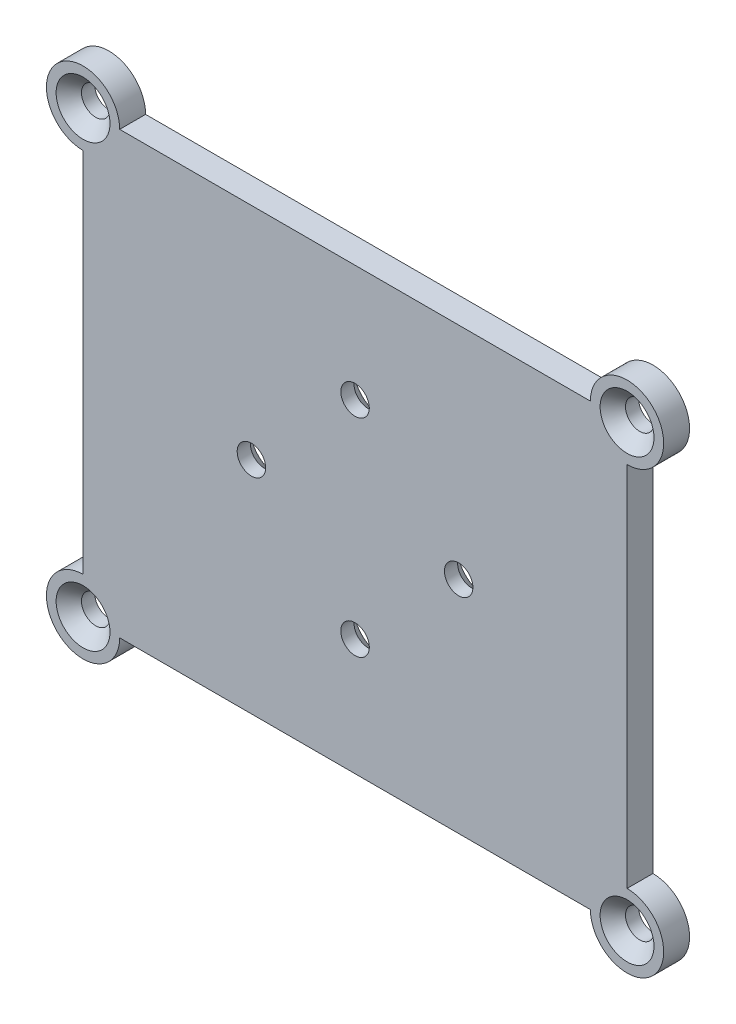
ISO-10303-21;
HEADER;
FILE_DESCRIPTION(('STEP AP214'),'2;1');
FILE_NAME('part.step','',(''),(''),'','','');
FILE_SCHEMA(('AUTOMOTIVE_DESIGN { 1 0 10303 214 1 1 1 1 }'));
ENDSEC;
DATA;
#1=APPLICATION_CONTEXT('core data for automotive mechanical design processes');
#2=APPLICATION_PROTOCOL_DEFINITION('international standard','automotive_design',2000,#1);
#3=PRODUCT_CONTEXT('',#1,'mechanical');
#4=PRODUCT('Part','Part','',(#3));
#5=PRODUCT_RELATED_PRODUCT_CATEGORY('part','',(#4));
#6=PRODUCT_DEFINITION_FORMATION('','',#4);
#7=PRODUCT_DEFINITION_CONTEXT('part definition',#1,'design');
#8=PRODUCT_DEFINITION('design','',#6,#7);
#9=PRODUCT_DEFINITION_SHAPE('','',#8);
#10=(LENGTH_UNIT() NAMED_UNIT(*) SI_UNIT(.MILLI.,.METRE.));
#11=(NAMED_UNIT(*) PLANE_ANGLE_UNIT() SI_UNIT($,.RADIAN.));
#12=(NAMED_UNIT(*) SI_UNIT($,.STERADIAN.) SOLID_ANGLE_UNIT());
#13=UNCERTAINTY_MEASURE_WITH_UNIT(LENGTH_MEASURE(1.E-05),#10,'distance_accuracy_value','');
#14=(GEOMETRIC_REPRESENTATION_CONTEXT(3) GLOBAL_UNCERTAINTY_ASSIGNED_CONTEXT((#13)) GLOBAL_UNIT_ASSIGNED_CONTEXT((#10,
#11,#12)) REPRESENTATION_CONTEXT('',''));
#15=CARTESIAN_POINT('',(0.,0.,0.));
#16=DIRECTION('',(0.,0.,1.));
#17=DIRECTION('',(1.,0.,0.));
#18=AXIS2_PLACEMENT_3D('',#15,#16,#17);
#19=CARTESIAN_POINT('',(0.,0.,5.));
#20=DIRECTION('',(0.,0.,-1.));
#21=DIRECTION('',(-1.,0.,0.));
#22=AXIS2_PLACEMENT_3D('',#19,#20,#21);
#23=PLANE('',#22);
#24=CARTESIAN_POINT('',(-52.5,42.5,5.));
#25=DIRECTION('',(0.,0.,1.));
#26=DIRECTION('',(1.,0.,0.));
#27=AXIS2_PLACEMENT_3D('',#24,#25,#26);
#28=CIRCLE('',#27,5.2);
#29=CARTESIAN_POINT('',(-47.3,42.5,5.));
#30=VERTEX_POINT('',#29);
#31=EDGE_CURVE('E333',#30,#30,#28,.T.);
#32=ORIENTED_EDGE('',*,*,#31,.F.);
#33=EDGE_LOOP('',(#32));
#34=FACE_BOUND('',#33,.T.);
#35=CARTESIAN_POINT('',(52.5,42.5,5.));
#36=DIRECTION('',(0.,0.,1.));
#37=DIRECTION('',(1.,0.,0.));
#38=AXIS2_PLACEMENT_3D('',#35,#36,#37);
#39=CIRCLE('',#38,5.2);
#40=CARTESIAN_POINT('',(57.7,42.5,5.));
#41=VERTEX_POINT('',#40);
#42=EDGE_CURVE('E338',#41,#41,#39,.T.);
#43=ORIENTED_EDGE('',*,*,#42,.F.);
#44=EDGE_LOOP('',(#43));
#45=FACE_BOUND('',#44,.T.);
#46=CARTESIAN_POINT('',(52.5,-42.5,5.));
#47=DIRECTION('',(0.,0.,1.));
#48=DIRECTION('',(1.,0.,0.));
#49=AXIS2_PLACEMENT_3D('',#46,#47,#48);
#50=CIRCLE('',#49,5.2);
#51=CARTESIAN_POINT('',(57.7,-42.5,5.));
#52=VERTEX_POINT('',#51);
#53=EDGE_CURVE('E345',#52,#52,#50,.T.);
#54=ORIENTED_EDGE('',*,*,#53,.F.);
#55=EDGE_LOOP('',(#54));
#56=FACE_BOUND('',#55,.T.);
#57=CARTESIAN_POINT('',(-52.5,-42.5,5.));
#58=DIRECTION('',(0.,0.,1.));
#59=DIRECTION('',(1.,0.,0.));
#60=AXIS2_PLACEMENT_3D('',#57,#58,#59);
#61=CIRCLE('',#60,5.2);
#62=CARTESIAN_POINT('',(-47.3,-42.5,5.));
#63=VERTEX_POINT('',#62);
#64=EDGE_CURVE('E352',#63,#63,#61,.T.);
#65=ORIENTED_EDGE('',*,*,#64,.F.);
#66=EDGE_LOOP('',(#65));
#67=FACE_BOUND('',#66,.T.);
#68=CARTESIAN_POINT('',(0.,20.,5.));
#69=DIRECTION('',(0.,0.,-1.));
#70=DIRECTION('',(-1.,0.,0.));
#71=AXIS2_PLACEMENT_3D('',#68,#69,#70);
#72=CIRCLE('',#71,2.75);
#73=CARTESIAN_POINT('',(-2.75,20.,5.));
#74=VERTEX_POINT('',#73);
#75=EDGE_CURVE('E177',#74,#74,#72,.T.);
#76=ORIENTED_EDGE('',*,*,#75,.T.);
#77=EDGE_LOOP('',(#76));
#78=FACE_BOUND('',#77,.T.);
#79=CARTESIAN_POINT('',(-20.,0.,5.));
#80=DIRECTION('',(0.,0.,-1.));
#81=DIRECTION('',(-1.,0.,0.));
#82=AXIS2_PLACEMENT_3D('',#79,#80,#81);
#83=CIRCLE('',#82,2.75);
#84=CARTESIAN_POINT('',(-22.75,0.,5.));
#85=VERTEX_POINT('',#84);
#86=EDGE_CURVE('E186',#85,#85,#83,.T.);
#87=ORIENTED_EDGE('',*,*,#86,.T.);
#88=EDGE_LOOP('',(#87));
#89=FACE_BOUND('',#88,.T.);
#90=CARTESIAN_POINT('',(0.,-20.,5.));
#91=DIRECTION('',(0.,0.,-1.));
#92=DIRECTION('',(-1.,0.,0.));
#93=AXIS2_PLACEMENT_3D('',#90,#91,#92);
#94=CIRCLE('',#93,2.75);
#95=CARTESIAN_POINT('',(-2.75,-20.,5.));
#96=VERTEX_POINT('',#95);
#97=EDGE_CURVE('E195',#96,#96,#94,.T.);
#98=ORIENTED_EDGE('',*,*,#97,.T.);
#99=EDGE_LOOP('',(#98));
#100=FACE_BOUND('',#99,.T.);
#101=CARTESIAN_POINT('',(20.,0.,5.));
#102=DIRECTION('',(0.,0.,-1.));
#103=DIRECTION('',(-1.,0.,0.));
#104=AXIS2_PLACEMENT_3D('',#101,#102,#103);
#105=CIRCLE('',#104,2.75);
#106=CARTESIAN_POINT('',(17.25,0.,5.));
#107=VERTEX_POINT('',#106);
#108=EDGE_CURVE('E11',#107,#107,#105,.T.);
#109=ORIENTED_EDGE('',*,*,#108,.T.);
#110=EDGE_LOOP('',(#109));
#111=FACE_BOUND('',#110,.T.);
#112=CARTESIAN_POINT('',(52.5,-42.5,5.));
#113=DIRECTION('',(0.,0.,1.));
#114=DIRECTION('',(1.,0.,0.));
#115=AXIS2_PLACEMENT_3D('',#112,#113,#114);
#116=CIRCLE('',#115,7.07106781186549);
#117=CARTESIAN_POINT('',(45.4289321881345,-42.5,5.));
#118=VERTEX_POINT('',#117);
#119=CARTESIAN_POINT('',(52.5,-35.4289321881345,5.));
#120=VERTEX_POINT('',#119);
#121=EDGE_CURVE('E138',#118,#120,#116,.T.);
#122=ORIENTED_EDGE('',*,*,#121,.T.);
#123=DIRECTION('',(0.,1.,0.));
#124=VECTOR('',#123,1.);
#125=CARTESIAN_POINT('',(52.5,0.,5.));
#126=LINE('',#125,#124);
#127=CARTESIAN_POINT('',(52.5,35.4289321881345,5.));
#128=VERTEX_POINT('',#127);
#129=EDGE_CURVE('E141',#120,#128,#126,.T.);
#130=ORIENTED_EDGE('',*,*,#129,.T.);
#131=CARTESIAN_POINT('',(52.5,42.5,5.));
#132=DIRECTION('',(0.,0.,1.));
#133=DIRECTION('',(1.,0.,0.));
#134=AXIS2_PLACEMENT_3D('',#131,#132,#133);
#135=CIRCLE('',#134,7.07106781186548);
#136=CARTESIAN_POINT('',(45.4289321881345,42.5,5.));
#137=VERTEX_POINT('',#136);
#138=EDGE_CURVE('E145',#128,#137,#135,.T.);
#139=ORIENTED_EDGE('',*,*,#138,.T.);
#140=DIRECTION('',(1.,0.,0.));
#141=VECTOR('',#140,1.);
#142=CARTESIAN_POINT('',(0.,42.5,5.));
#143=LINE('',#142,#141);
#144=CARTESIAN_POINT('',(-45.4289321881345,42.5,5.));
#145=VERTEX_POINT('',#144);
#146=EDGE_CURVE('E148',#145,#137,#143,.T.);
#147=ORIENTED_EDGE('',*,*,#146,.F.);
#148=CARTESIAN_POINT('',(-52.5,42.5,5.));
#149=DIRECTION('',(0.,0.,1.));
#150=DIRECTION('',(1.,0.,0.));
#151=AXIS2_PLACEMENT_3D('',#148,#149,#150);
#152=CIRCLE('',#151,7.07106781186547);
#153=CARTESIAN_POINT('',(-52.5,35.4289321881345,5.));
#154=VERTEX_POINT('',#153);
#155=EDGE_CURVE('E151',#145,#154,#152,.T.);
#156=ORIENTED_EDGE('',*,*,#155,.T.);
#157=DIRECTION('',(0.,1.,0.));
#158=VECTOR('',#157,1.);
#159=CARTESIAN_POINT('',(-52.5,0.,5.));
#160=LINE('',#159,#158);
#161=CARTESIAN_POINT('',(-52.5,-35.4289321881345,5.));
#162=VERTEX_POINT('',#161);
#163=EDGE_CURVE('E154',#162,#154,#160,.T.);
#164=ORIENTED_EDGE('',*,*,#163,.F.);
#165=CARTESIAN_POINT('',(-52.5,-42.5,5.));
#166=DIRECTION('',(0.,0.,1.));
#167=DIRECTION('',(1.,0.,0.));
#168=AXIS2_PLACEMENT_3D('',#165,#166,#167);
#169=CIRCLE('',#168,7.07106781186548);
#170=CARTESIAN_POINT('',(-45.4289321881345,-42.5,5.));
#171=VERTEX_POINT('',#170);
#172=EDGE_CURVE('E119',#162,#171,#169,.T.);
#173=ORIENTED_EDGE('',*,*,#172,.T.);
#174=DIRECTION('',(1.,0.,0.));
#175=VECTOR('',#174,1.);
#176=CARTESIAN_POINT('',(0.,-42.5,5.));
#177=LINE('',#176,#175);
#178=EDGE_CURVE('E157',#171,#118,#177,.T.);
#179=ORIENTED_EDGE('',*,*,#178,.T.);
#180=EDGE_LOOP('',(#122,#130,#139,#147,#156,#164,#173,#179));
#181=FACE_BOUND('',#180,.T.);
#182=ADVANCED_FACE('F41',(#34,#45,#56,#67,#78,#89,#100,#111,#181),#23,.F.);
#183=CARTESIAN_POINT('',(0.,0.,0.));
#184=DIRECTION('',(0.,0.,-1.));
#185=DIRECTION('',(-1.,0.,0.));
#186=AXIS2_PLACEMENT_3D('',#183,#184,#185);
#187=PLANE('',#186);
#188=CARTESIAN_POINT('',(-52.5,42.5,0.));
#189=DIRECTION('',(0.,0.,1.));
#190=DIRECTION('',(1.,0.,0.));
#191=AXIS2_PLACEMENT_3D('',#188,#189,#190);
#192=CIRCLE('',#191,2.75);
#193=CARTESIAN_POINT('',(-49.75,42.5,0.));
#194=VERTEX_POINT('',#193);
#195=EDGE_CURVE('E225',#194,#194,#192,.T.);
#196=ORIENTED_EDGE('',*,*,#195,.T.);
#197=EDGE_LOOP('',(#196));
#198=FACE_BOUND('',#197,.T.);
#199=CARTESIAN_POINT('',(52.5,42.5,0.));
#200=DIRECTION('',(0.,0.,1.));
#201=DIRECTION('',(1.,0.,0.));
#202=AXIS2_PLACEMENT_3D('',#199,#200,#201);
#203=CIRCLE('',#202,2.75);
#204=CARTESIAN_POINT('',(55.25,42.5,0.));
#205=VERTEX_POINT('',#204);
#206=EDGE_CURVE('E229',#205,#205,#203,.T.);
#207=ORIENTED_EDGE('',*,*,#206,.T.);
#208=EDGE_LOOP('',(#207));
#209=FACE_BOUND('',#208,.T.);
#210=CARTESIAN_POINT('',(52.5,-42.5,0.));
#211=DIRECTION('',(0.,0.,1.));
#212=DIRECTION('',(1.,0.,0.));
#213=AXIS2_PLACEMENT_3D('',#210,#211,#212);
#214=CIRCLE('',#213,2.75);
#215=CARTESIAN_POINT('',(55.25,-42.5,0.));
#216=VERTEX_POINT('',#215);
#217=EDGE_CURVE('E233',#216,#216,#214,.T.);
#218=ORIENTED_EDGE('',*,*,#217,.T.);
#219=EDGE_LOOP('',(#218));
#220=FACE_BOUND('',#219,.T.);
#221=CARTESIAN_POINT('',(-52.5,-42.5,0.));
#222=DIRECTION('',(0.,0.,1.));
#223=DIRECTION('',(1.,0.,0.));
#224=AXIS2_PLACEMENT_3D('',#221,#222,#223);
#225=CIRCLE('',#224,2.75);
#226=CARTESIAN_POINT('',(-49.75,-42.5,0.));
#227=VERTEX_POINT('',#226);
#228=EDGE_CURVE('E142',#227,#227,#225,.T.);
#229=ORIENTED_EDGE('',*,*,#228,.T.);
#230=EDGE_LOOP('',(#229));
#231=FACE_BOUND('',#230,.T.);
#232=CARTESIAN_POINT('',(0.,20.,0.));
#233=DIRECTION('',(0.,0.,-1.));
#234=DIRECTION('',(-1.,0.,0.));
#235=AXIS2_PLACEMENT_3D('',#232,#233,#234);
#236=CIRCLE('',#235,5.2);
#237=CARTESIAN_POINT('',(-5.20000000000001,20.,0.));
#238=VERTEX_POINT('',#237);
#239=EDGE_CURVE('E162',#238,#238,#236,.T.);
#240=ORIENTED_EDGE('',*,*,#239,.F.);
#241=EDGE_LOOP('',(#240));
#242=FACE_BOUND('',#241,.T.);
#243=CARTESIAN_POINT('',(-20.,0.,0.));
#244=DIRECTION('',(0.,0.,-1.));
#245=DIRECTION('',(-1.,0.,0.));
#246=AXIS2_PLACEMENT_3D('',#243,#244,#245);
#247=CIRCLE('',#246,5.2);
#248=CARTESIAN_POINT('',(-25.2,0.,0.));
#249=VERTEX_POINT('',#248);
#250=EDGE_CURVE('E180',#249,#249,#247,.T.);
#251=ORIENTED_EDGE('',*,*,#250,.F.);
#252=EDGE_LOOP('',(#251));
#253=FACE_BOUND('',#252,.T.);
#254=CARTESIAN_POINT('',(0.,-20.,0.));
#255=DIRECTION('',(0.,0.,-1.));
#256=DIRECTION('',(-1.,0.,0.));
#257=AXIS2_PLACEMENT_3D('',#254,#255,#256);
#258=CIRCLE('',#257,5.2);
#259=CARTESIAN_POINT('',(-5.2,-20.,0.));
#260=VERTEX_POINT('',#259);
#261=EDGE_CURVE('E189',#260,#260,#258,.T.);
#262=ORIENTED_EDGE('',*,*,#261,.F.);
#263=EDGE_LOOP('',(#262));
#264=FACE_BOUND('',#263,.T.);
#265=CARTESIAN_POINT('',(20.,0.,0.));
#266=DIRECTION('',(0.,0.,-1.));
#267=DIRECTION('',(-1.,0.,0.));
#268=AXIS2_PLACEMENT_3D('',#265,#266,#267);
#269=CIRCLE('',#268,5.2);
#270=CARTESIAN_POINT('',(14.8,0.,0.));
#271=VERTEX_POINT('',#270);
#272=EDGE_CURVE('E198',#271,#271,#269,.T.);
#273=ORIENTED_EDGE('',*,*,#272,.F.);
#274=EDGE_LOOP('',(#273));
#275=FACE_BOUND('',#274,.T.);
#276=CARTESIAN_POINT('',(52.5,-42.5,0.));
#277=DIRECTION('',(0.,0.,1.));
#278=DIRECTION('',(1.,0.,0.));
#279=AXIS2_PLACEMENT_3D('',#276,#277,#278);
#280=CIRCLE('',#279,7.07106781186549);
#281=CARTESIAN_POINT('',(45.4289321881345,-42.5,0.));
#282=VERTEX_POINT('',#281);
#283=CARTESIAN_POINT('',(52.5,-35.4289321881345,0.));
#284=VERTEX_POINT('',#283);
#285=EDGE_CURVE('E160',#282,#284,#280,.T.);
#286=ORIENTED_EDGE('',*,*,#285,.F.);
#287=DIRECTION('',(1.,0.,0.));
#288=VECTOR('',#287,1.);
#289=CARTESIAN_POINT('',(0.,-42.5,0.));
#290=LINE('',#289,#288);
#291=CARTESIAN_POINT('',(-45.4289321881345,-42.5,0.));
#292=VERTEX_POINT('',#291);
#293=EDGE_CURVE('E133',#292,#282,#290,.T.);
#294=ORIENTED_EDGE('',*,*,#293,.F.);
#295=CARTESIAN_POINT('',(-52.5,-42.5,0.));
#296=DIRECTION('',(0.,0.,1.));
#297=DIRECTION('',(1.,0.,0.));
#298=AXIS2_PLACEMENT_3D('',#295,#296,#297);
#299=CIRCLE('',#298,7.07106781186548);
#300=CARTESIAN_POINT('',(-52.5,-35.4289321881345,0.));
#301=VERTEX_POINT('',#300);
#302=EDGE_CURVE('E117',#301,#292,#299,.T.);
#303=ORIENTED_EDGE('',*,*,#302,.F.);
#304=DIRECTION('',(0.,1.,0.));
#305=VECTOR('',#304,1.);
#306=CARTESIAN_POINT('',(-52.5,0.,0.));
#307=LINE('',#306,#305);
#308=CARTESIAN_POINT('',(-52.5,35.4289321881345,0.));
#309=VERTEX_POINT('',#308);
#310=EDGE_CURVE('E126',#301,#309,#307,.T.);
#311=ORIENTED_EDGE('',*,*,#310,.T.);
#312=CARTESIAN_POINT('',(-52.5,42.5,0.));
#313=DIRECTION('',(0.,0.,1.));
#314=DIRECTION('',(1.,0.,0.));
#315=AXIS2_PLACEMENT_3D('',#312,#313,#314);
#316=CIRCLE('',#315,7.07106781186547);
#317=CARTESIAN_POINT('',(-45.4289321881345,42.5,0.));
#318=VERTEX_POINT('',#317);
#319=EDGE_CURVE('E131',#318,#309,#316,.T.);
#320=ORIENTED_EDGE('',*,*,#319,.F.);
#321=DIRECTION('',(1.,0.,0.));
#322=VECTOR('',#321,1.);
#323=CARTESIAN_POINT('',(0.,42.5,0.));
#324=LINE('',#323,#322);
#325=CARTESIAN_POINT('',(45.4289321881345,42.5,0.));
#326=VERTEX_POINT('',#325);
#327=EDGE_CURVE('E365',#318,#326,#324,.T.);
#328=ORIENTED_EDGE('',*,*,#327,.T.);
#329=CARTESIAN_POINT('',(52.5,42.5,0.));
#330=DIRECTION('',(0.,0.,1.));
#331=DIRECTION('',(1.,0.,0.));
#332=AXIS2_PLACEMENT_3D('',#329,#330,#331);
#333=CIRCLE('',#332,7.07106781186548);
#334=CARTESIAN_POINT('',(52.5,35.4289321881345,0.));
#335=VERTEX_POINT('',#334);
#336=EDGE_CURVE('E362',#335,#326,#333,.T.);
#337=ORIENTED_EDGE('',*,*,#336,.F.);
#338=DIRECTION('',(0.,1.,0.));
#339=VECTOR('',#338,1.);
#340=CARTESIAN_POINT('',(52.5,0.,0.));
#341=LINE('',#340,#339);
#342=EDGE_CURVE('E360',#284,#335,#341,.T.);
#343=ORIENTED_EDGE('',*,*,#342,.F.);
#344=EDGE_LOOP('',(#286,#294,#303,#311,#320,#328,#337,#343));
#345=FACE_BOUND('',#344,.T.);
#346=ADVANCED_FACE('F43',(#198,#209,#220,#231,#242,#253,#264,#275,#345),#187,.T.);
#347=CARTESIAN_POINT('',(20.,0.,0.));
#348=DIRECTION('',(0.,0.,-1.));
#349=DIRECTION('',(-1.,0.,0.));
#350=AXIS2_PLACEMENT_3D('',#347,#348,#349);
#351=CYLINDRICAL_SURFACE('',#350,2.75);
#352=ORIENTED_EDGE('',*,*,#108,.F.);
#353=EDGE_LOOP('',(#352));
#354=FACE_BOUND('',#353,.T.);
#355=CARTESIAN_POINT('',(20.,0.,2.45));
#356=DIRECTION('',(0.,0.,-1.));
#357=DIRECTION('',(-1.,0.,0.));
#358=AXIS2_PLACEMENT_3D('',#355,#356,#357);
#359=CIRCLE('',#358,2.75);
#360=CARTESIAN_POINT('',(17.25,0.,2.45));
#361=VERTEX_POINT('',#360);
#362=EDGE_CURVE('E50',#361,#361,#359,.T.);
#363=ORIENTED_EDGE('',*,*,#362,.T.);
#364=EDGE_LOOP('',(#363));
#365=FACE_BOUND('',#364,.T.);
#366=ADVANCED_FACE('F203',(#354,#365),#351,.F.);
#367=CARTESIAN_POINT('',(20.,0.,0.));
#368=DIRECTION('',(0.,0.,-1.));
#369=DIRECTION('',(-1.,0.,0.));
#370=AXIS2_PLACEMENT_3D('',#367,#368,#369);
#371=CONICAL_SURFACE('',#370,5.2,0.785398163397448);
#372=ORIENTED_EDGE('',*,*,#362,.F.);
#373=EDGE_LOOP('',(#372));
#374=FACE_BOUND('',#373,.T.);
#375=ORIENTED_EDGE('',*,*,#272,.T.);
#376=EDGE_LOOP('',(#375));
#377=FACE_BOUND('',#376,.T.);
#378=ADVANCED_FACE('F205',(#374,#377),#371,.F.);
#379=CARTESIAN_POINT('',(0.,-20.,0.));
#380=DIRECTION('',(0.,0.,-1.));
#381=DIRECTION('',(-1.,0.,0.));
#382=AXIS2_PLACEMENT_3D('',#379,#380,#381);
#383=CYLINDRICAL_SURFACE('',#382,2.75);
#384=ORIENTED_EDGE('',*,*,#97,.F.);
#385=EDGE_LOOP('',(#384));
#386=FACE_BOUND('',#385,.T.);
#387=CARTESIAN_POINT('',(0.,-20.,2.45));
#388=DIRECTION('',(0.,0.,-1.));
#389=DIRECTION('',(-1.,0.,0.));
#390=AXIS2_PLACEMENT_3D('',#387,#388,#389);
#391=CIRCLE('',#390,2.75);
#392=CARTESIAN_POINT('',(-2.75,-20.,2.45));
#393=VERTEX_POINT('',#392);
#394=EDGE_CURVE('E192',#393,#393,#391,.T.);
#395=ORIENTED_EDGE('',*,*,#394,.T.);
#396=EDGE_LOOP('',(#395));
#397=FACE_BOUND('',#396,.T.);
#398=ADVANCED_FACE('F208',(#386,#397),#383,.F.);
#399=CARTESIAN_POINT('',(0.,-20.,0.));
#400=DIRECTION('',(0.,0.,-1.));
#401=DIRECTION('',(-1.,0.,0.));
#402=AXIS2_PLACEMENT_3D('',#399,#400,#401);
#403=CONICAL_SURFACE('',#402,5.2,0.785398163397448);
#404=ORIENTED_EDGE('',*,*,#394,.F.);
#405=EDGE_LOOP('',(#404));
#406=FACE_BOUND('',#405,.T.);
#407=ORIENTED_EDGE('',*,*,#261,.T.);
#408=EDGE_LOOP('',(#407));
#409=FACE_BOUND('',#408,.T.);
#410=ADVANCED_FACE('F243',(#406,#409),#403,.F.);
#411=CARTESIAN_POINT('',(-20.,0.,0.));
#412=DIRECTION('',(0.,0.,-1.));
#413=DIRECTION('',(-1.,0.,0.));
#414=AXIS2_PLACEMENT_3D('',#411,#412,#413);
#415=CYLINDRICAL_SURFACE('',#414,2.75);
#416=ORIENTED_EDGE('',*,*,#86,.F.);
#417=EDGE_LOOP('',(#416));
#418=FACE_BOUND('',#417,.T.);
#419=CARTESIAN_POINT('',(-20.,0.,2.45));
#420=DIRECTION('',(0.,0.,-1.));
#421=DIRECTION('',(-1.,0.,0.));
#422=AXIS2_PLACEMENT_3D('',#419,#420,#421);
#423=CIRCLE('',#422,2.75);
#424=CARTESIAN_POINT('',(-22.75,0.,2.45));
#425=VERTEX_POINT('',#424);
#426=EDGE_CURVE('E183',#425,#425,#423,.T.);
#427=ORIENTED_EDGE('',*,*,#426,.T.);
#428=EDGE_LOOP('',(#427));
#429=FACE_BOUND('',#428,.T.);
#430=ADVANCED_FACE('F245',(#418,#429),#415,.F.);
#431=CARTESIAN_POINT('',(-20.,0.,0.));
#432=DIRECTION('',(0.,0.,-1.));
#433=DIRECTION('',(-1.,0.,0.));
#434=AXIS2_PLACEMENT_3D('',#431,#432,#433);
#435=CONICAL_SURFACE('',#434,5.2,0.785398163397448);
#436=ORIENTED_EDGE('',*,*,#426,.F.);
#437=EDGE_LOOP('',(#436));
#438=FACE_BOUND('',#437,.T.);
#439=ORIENTED_EDGE('',*,*,#250,.T.);
#440=EDGE_LOOP('',(#439));
#441=FACE_BOUND('',#440,.T.);
#442=ADVANCED_FACE('F252',(#438,#441),#435,.F.);
#443=CARTESIAN_POINT('',(0.,20.,0.));
#444=DIRECTION('',(0.,0.,-1.));
#445=DIRECTION('',(-1.,0.,0.));
#446=AXIS2_PLACEMENT_3D('',#443,#444,#445);
#447=CYLINDRICAL_SURFACE('',#446,2.75);
#448=ORIENTED_EDGE('',*,*,#75,.F.);
#449=EDGE_LOOP('',(#448));
#450=FACE_BOUND('',#449,.T.);
#451=CARTESIAN_POINT('',(0.,20.,2.45));
#452=DIRECTION('',(0.,0.,-1.));
#453=DIRECTION('',(-1.,0.,0.));
#454=AXIS2_PLACEMENT_3D('',#451,#452,#453);
#455=CIRCLE('',#454,2.75);
#456=CARTESIAN_POINT('',(-2.75,20.,2.45));
#457=VERTEX_POINT('',#456);
#458=EDGE_CURVE('E174',#457,#457,#455,.T.);
#459=ORIENTED_EDGE('',*,*,#458,.T.);
#460=EDGE_LOOP('',(#459));
#461=FACE_BOUND('',#460,.T.);
#462=ADVANCED_FACE('F261',(#450,#461),#447,.F.);
#463=CARTESIAN_POINT('',(0.,20.,0.));
#464=DIRECTION('',(0.,0.,-1.));
#465=DIRECTION('',(-1.,0.,0.));
#466=AXIS2_PLACEMENT_3D('',#463,#464,#465);
#467=CONICAL_SURFACE('',#466,5.2,0.785398163397448);
#468=ORIENTED_EDGE('',*,*,#458,.F.);
#469=EDGE_LOOP('',(#468));
#470=FACE_BOUND('',#469,.T.);
#471=ORIENTED_EDGE('',*,*,#239,.T.);
#472=EDGE_LOOP('',(#471));
#473=FACE_BOUND('',#472,.T.);
#474=ADVANCED_FACE('F265',(#470,#473),#467,.F.);
#475=CARTESIAN_POINT('',(52.5,-42.5,0.));
#476=DIRECTION('',(0.,0.,1.));
#477=DIRECTION('',(1.,0.,0.));
#478=AXIS2_PLACEMENT_3D('',#475,#476,#477);
#479=CYLINDRICAL_SURFACE('',#478,7.07106781186549);
#480=ORIENTED_EDGE('',*,*,#121,.F.);
#481=DIRECTION('',(0.,0.,1.));
#482=VECTOR('',#481,1.);
#483=CARTESIAN_POINT('',(45.4289321881345,-42.5,0.));
#484=LINE('',#483,#482);
#485=EDGE_CURVE('E58',#282,#118,#484,.T.);
#486=ORIENTED_EDGE('',*,*,#485,.F.);
#487=ORIENTED_EDGE('',*,*,#285,.T.);
#488=DIRECTION('',(0.,0.,1.));
#489=VECTOR('',#488,1.);
#490=CARTESIAN_POINT('',(52.5,-35.4289321881345,0.));
#491=LINE('',#490,#489);
#492=EDGE_CURVE('E99',#284,#120,#491,.T.);
#493=ORIENTED_EDGE('',*,*,#492,.T.);
#494=EDGE_LOOP('',(#480,#486,#487,#493));
#495=FACE_BOUND('',#494,.T.);
#496=ADVANCED_FACE('F269',(#495),#479,.T.);
#497=CARTESIAN_POINT('',(0.,-42.5,0.));
#498=DIRECTION('',(0.,-1.,0.));
#499=DIRECTION('',(0.,0.,-1.));
#500=AXIS2_PLACEMENT_3D('',#497,#498,#499);
#501=PLANE('',#500);
#502=ORIENTED_EDGE('',*,*,#178,.F.);
#503=DIRECTION('',(0.,0.,1.));
#504=VECTOR('',#503,1.);
#505=CARTESIAN_POINT('',(-45.4289321881345,-42.5,0.));
#506=LINE('',#505,#504);
#507=EDGE_CURVE('E87',#292,#171,#506,.T.);
#508=ORIENTED_EDGE('',*,*,#507,.F.);
#509=ORIENTED_EDGE('',*,*,#293,.T.);
#510=ORIENTED_EDGE('',*,*,#485,.T.);
#511=EDGE_LOOP('',(#502,#508,#509,#510));
#512=FACE_BOUND('',#511,.T.);
#513=ADVANCED_FACE('F273',(#512),#501,.T.);
#514=CARTESIAN_POINT('',(-52.5,-42.5,0.));
#515=DIRECTION('',(0.,0.,1.));
#516=DIRECTION('',(1.,0.,0.));
#517=AXIS2_PLACEMENT_3D('',#514,#515,#516);
#518=CYLINDRICAL_SURFACE('',#517,7.07106781186548);
#519=ORIENTED_EDGE('',*,*,#172,.F.);
#520=DIRECTION('',(0.,0.,1.));
#521=VECTOR('',#520,1.);
#522=CARTESIAN_POINT('',(-52.5,-35.4289321881345,0.));
#523=LINE('',#522,#521);
#524=EDGE_CURVE('E113',#301,#162,#523,.T.);
#525=ORIENTED_EDGE('',*,*,#524,.F.);
#526=ORIENTED_EDGE('',*,*,#302,.T.);
#527=ORIENTED_EDGE('',*,*,#507,.T.);
#528=EDGE_LOOP('',(#519,#525,#526,#527));
#529=FACE_BOUND('',#528,.T.);
#530=ADVANCED_FACE('F115',(#529),#518,.T.);
#531=CARTESIAN_POINT('',(-52.5,0.,0.));
#532=DIRECTION('',(1.,0.,0.));
#533=DIRECTION('',(0.,0.,-1.));
#534=AXIS2_PLACEMENT_3D('',#531,#532,#533);
#535=PLANE('',#534);
#536=ORIENTED_EDGE('',*,*,#163,.T.);
#537=DIRECTION('',(0.,0.,1.));
#538=VECTOR('',#537,1.);
#539=CARTESIAN_POINT('',(-52.5,35.4289321881345,0.));
#540=LINE('',#539,#538);
#541=EDGE_CURVE('E123',#309,#154,#540,.T.);
#542=ORIENTED_EDGE('',*,*,#541,.F.);
#543=ORIENTED_EDGE('',*,*,#310,.F.);
#544=ORIENTED_EDGE('',*,*,#524,.T.);
#545=EDGE_LOOP('',(#536,#542,#543,#544));
#546=FACE_BOUND('',#545,.T.);
#547=ADVANCED_FACE('F127',(#546),#535,.F.);
#548=CARTESIAN_POINT('',(-52.5,42.5,0.));
#549=DIRECTION('',(0.,0.,1.));
#550=DIRECTION('',(1.,0.,0.));
#551=AXIS2_PLACEMENT_3D('',#548,#549,#550);
#552=CYLINDRICAL_SURFACE('',#551,7.07106781186547);
#553=ORIENTED_EDGE('',*,*,#155,.F.);
#554=DIRECTION('',(0.,0.,1.));
#555=VECTOR('',#554,1.);
#556=CARTESIAN_POINT('',(-45.4289321881345,42.5,0.));
#557=LINE('',#556,#555);
#558=EDGE_CURVE('E165',#318,#145,#557,.T.);
#559=ORIENTED_EDGE('',*,*,#558,.F.);
#560=ORIENTED_EDGE('',*,*,#319,.T.);
#561=ORIENTED_EDGE('',*,*,#541,.T.);
#562=EDGE_LOOP('',(#553,#559,#560,#561));
#563=FACE_BOUND('',#562,.T.);
#564=ADVANCED_FACE('F285',(#563),#552,.T.);
#565=CARTESIAN_POINT('',(0.,42.5,0.));
#566=DIRECTION('',(0.,-1.,0.));
#567=DIRECTION('',(0.,0.,-1.));
#568=AXIS2_PLACEMENT_3D('',#565,#566,#567);
#569=PLANE('',#568);
#570=ORIENTED_EDGE('',*,*,#146,.T.);
#571=DIRECTION('',(0.,0.,1.));
#572=VECTOR('',#571,1.);
#573=CARTESIAN_POINT('',(45.4289321881345,42.5,0.));
#574=LINE('',#573,#572);
#575=EDGE_CURVE('E167',#326,#137,#574,.T.);
#576=ORIENTED_EDGE('',*,*,#575,.F.);
#577=ORIENTED_EDGE('',*,*,#327,.F.);
#578=ORIENTED_EDGE('',*,*,#558,.T.);
#579=EDGE_LOOP('',(#570,#576,#577,#578));
#580=FACE_BOUND('',#579,.T.);
#581=ADVANCED_FACE('F281',(#580),#569,.F.);
#582=CARTESIAN_POINT('',(52.5,42.5,0.));
#583=DIRECTION('',(0.,0.,1.));
#584=DIRECTION('',(1.,0.,0.));
#585=AXIS2_PLACEMENT_3D('',#582,#583,#584);
#586=CYLINDRICAL_SURFACE('',#585,7.07106781186548);
#587=ORIENTED_EDGE('',*,*,#138,.F.);
#588=DIRECTION('',(0.,0.,1.));
#589=VECTOR('',#588,1.);
#590=CARTESIAN_POINT('',(52.5,35.4289321881345,0.));
#591=LINE('',#590,#589);
#592=EDGE_CURVE('E169',#335,#128,#591,.T.);
#593=ORIENTED_EDGE('',*,*,#592,.F.);
#594=ORIENTED_EDGE('',*,*,#336,.T.);
#595=ORIENTED_EDGE('',*,*,#575,.T.);
#596=EDGE_LOOP('',(#587,#593,#594,#595));
#597=FACE_BOUND('',#596,.T.);
#598=ADVANCED_FACE('F278',(#597),#586,.T.);
#599=CARTESIAN_POINT('',(52.5,0.,0.));
#600=DIRECTION('',(1.,0.,0.));
#601=DIRECTION('',(0.,0.,-1.));
#602=AXIS2_PLACEMENT_3D('',#599,#600,#601);
#603=PLANE('',#602);
#604=ORIENTED_EDGE('',*,*,#129,.F.);
#605=ORIENTED_EDGE('',*,*,#492,.F.);
#606=ORIENTED_EDGE('',*,*,#342,.T.);
#607=ORIENTED_EDGE('',*,*,#592,.T.);
#608=EDGE_LOOP('',(#604,#605,#606,#607));
#609=FACE_BOUND('',#608,.T.);
#610=ADVANCED_FACE('F274',(#609),#603,.T.);
#611=CARTESIAN_POINT('',(-52.5,-42.5,5.));
#612=DIRECTION('',(0.,0.,1.));
#613=DIRECTION('',(1.,0.,0.));
#614=AXIS2_PLACEMENT_3D('',#611,#612,#613);
#615=CYLINDRICAL_SURFACE('',#614,2.74999999999999);
#616=ORIENTED_EDGE('',*,*,#228,.F.);
#617=EDGE_LOOP('',(#616));
#618=FACE_BOUND('',#617,.T.);
#619=CARTESIAN_POINT('',(-52.5,-42.5,2.54999999999999));
#620=DIRECTION('',(0.,0.,1.));
#621=DIRECTION('',(1.,0.,0.));
#622=AXIS2_PLACEMENT_3D('',#619,#620,#621);
#623=CIRCLE('',#622,2.74999999999999);
#624=CARTESIAN_POINT('',(-49.75,-42.5,2.54999999999999));
#625=VERTEX_POINT('',#624);
#626=EDGE_CURVE('E355',#625,#625,#623,.T.);
#627=ORIENTED_EDGE('',*,*,#626,.T.);
#628=EDGE_LOOP('',(#627));
#629=FACE_BOUND('',#628,.T.);
#630=ADVANCED_FACE('F277',(#618,#629),#615,.F.);
#631=CARTESIAN_POINT('',(-52.5,-42.5,5.));
#632=DIRECTION('',(0.,0.,1.));
#633=DIRECTION('',(1.,0.,0.));
#634=AXIS2_PLACEMENT_3D('',#631,#632,#633);
#635=CONICAL_SURFACE('',#634,5.2,0.785398163397449);
#636=ORIENTED_EDGE('',*,*,#626,.F.);
#637=EDGE_LOOP('',(#636));
#638=FACE_BOUND('',#637,.T.);
#639=ORIENTED_EDGE('',*,*,#64,.T.);
#640=EDGE_LOOP('',(#639));
#641=FACE_BOUND('',#640,.T.);
#642=ADVANCED_FACE('F297',(#638,#641),#635,.F.);
#643=CARTESIAN_POINT('',(52.5,-42.5,5.));
#644=DIRECTION('',(0.,0.,1.));
#645=DIRECTION('',(1.,0.,0.));
#646=AXIS2_PLACEMENT_3D('',#643,#644,#645);
#647=CYLINDRICAL_SURFACE('',#646,2.74999999999999);
#648=ORIENTED_EDGE('',*,*,#217,.F.);
#649=EDGE_LOOP('',(#648));
#650=FACE_BOUND('',#649,.T.);
#651=CARTESIAN_POINT('',(52.5,-42.5,2.54999999999999));
#652=DIRECTION('',(0.,0.,1.));
#653=DIRECTION('',(1.,0.,0.));
#654=AXIS2_PLACEMENT_3D('',#651,#652,#653);
#655=CIRCLE('',#654,2.74999999999999);
#656=CARTESIAN_POINT('',(55.25,-42.5,2.54999999999999));
#657=VERTEX_POINT('',#656);
#658=EDGE_CURVE('E348',#657,#657,#655,.T.);
#659=ORIENTED_EDGE('',*,*,#658,.T.);
#660=EDGE_LOOP('',(#659));
#661=FACE_BOUND('',#660,.T.);
#662=ADVANCED_FACE('F301',(#650,#661),#647,.F.);
#663=CARTESIAN_POINT('',(52.5,-42.5,5.));
#664=DIRECTION('',(0.,0.,1.));
#665=DIRECTION('',(1.,0.,0.));
#666=AXIS2_PLACEMENT_3D('',#663,#664,#665);
#667=CONICAL_SURFACE('',#666,5.2,0.785398163397448);
#668=ORIENTED_EDGE('',*,*,#658,.F.);
#669=EDGE_LOOP('',(#668));
#670=FACE_BOUND('',#669,.T.);
#671=ORIENTED_EDGE('',*,*,#53,.T.);
#672=EDGE_LOOP('',(#671));
#673=FACE_BOUND('',#672,.T.);
#674=ADVANCED_FACE('F305',(#670,#673),#667,.F.);
#675=CARTESIAN_POINT('',(52.5,42.5,5.));
#676=DIRECTION('',(0.,0.,1.));
#677=DIRECTION('',(1.,0.,0.));
#678=AXIS2_PLACEMENT_3D('',#675,#676,#677);
#679=CYLINDRICAL_SURFACE('',#678,2.74999999999999);
#680=ORIENTED_EDGE('',*,*,#206,.F.);
#681=EDGE_LOOP('',(#680));
#682=FACE_BOUND('',#681,.T.);
#683=CARTESIAN_POINT('',(52.5,42.5,2.54999999999999));
#684=DIRECTION('',(0.,0.,1.));
#685=DIRECTION('',(1.,0.,0.));
#686=AXIS2_PLACEMENT_3D('',#683,#684,#685);
#687=CIRCLE('',#686,2.74999999999999);
#688=CARTESIAN_POINT('',(55.25,42.5,2.54999999999999));
#689=VERTEX_POINT('',#688);
#690=EDGE_CURVE('E341',#689,#689,#687,.T.);
#691=ORIENTED_EDGE('',*,*,#690,.T.);
#692=EDGE_LOOP('',(#691));
#693=FACE_BOUND('',#692,.T.);
#694=ADVANCED_FACE('F309',(#682,#693),#679,.F.);
#695=CARTESIAN_POINT('',(52.5,42.5,5.));
#696=DIRECTION('',(0.,0.,1.));
#697=DIRECTION('',(1.,0.,0.));
#698=AXIS2_PLACEMENT_3D('',#695,#696,#697);
#699=CONICAL_SURFACE('',#698,5.2,0.785398163397448);
#700=ORIENTED_EDGE('',*,*,#690,.F.);
#701=EDGE_LOOP('',(#700));
#702=FACE_BOUND('',#701,.T.);
#703=ORIENTED_EDGE('',*,*,#42,.T.);
#704=EDGE_LOOP('',(#703));
#705=FACE_BOUND('',#704,.T.);
#706=ADVANCED_FACE('F313',(#702,#705),#699,.F.);
#707=CARTESIAN_POINT('',(-52.5,42.5,5.));
#708=DIRECTION('',(0.,0.,1.));
#709=DIRECTION('',(1.,0.,0.));
#710=AXIS2_PLACEMENT_3D('',#707,#708,#709);
#711=CYLINDRICAL_SURFACE('',#710,2.74999999999999);
#712=ORIENTED_EDGE('',*,*,#195,.F.);
#713=EDGE_LOOP('',(#712));
#714=FACE_BOUND('',#713,.T.);
#715=CARTESIAN_POINT('',(-52.5,42.5,2.54999999999999));
#716=DIRECTION('',(0.,0.,1.));
#717=DIRECTION('',(1.,0.,0.));
#718=AXIS2_PLACEMENT_3D('',#715,#716,#717);
#719=CIRCLE('',#718,2.74999999999999);
#720=CARTESIAN_POINT('',(-49.75,42.5,2.54999999999999));
#721=VERTEX_POINT('',#720);
#722=EDGE_CURVE('E330',#721,#721,#719,.T.);
#723=ORIENTED_EDGE('',*,*,#722,.T.);
#724=EDGE_LOOP('',(#723));
#725=FACE_BOUND('',#724,.T.);
#726=ADVANCED_FACE('F317',(#714,#725),#711,.F.);
#727=CARTESIAN_POINT('',(-52.5,42.5,5.));
#728=DIRECTION('',(0.,0.,1.));
#729=DIRECTION('',(1.,0.,0.));
#730=AXIS2_PLACEMENT_3D('',#727,#728,#729);
#731=CONICAL_SURFACE('',#730,5.2,0.785398163397449);
#732=ORIENTED_EDGE('',*,*,#722,.F.);
#733=EDGE_LOOP('',(#732));
#734=FACE_BOUND('',#733,.T.);
#735=ORIENTED_EDGE('',*,*,#31,.T.);
#736=EDGE_LOOP('',(#735));
#737=FACE_BOUND('',#736,.T.);
#738=ADVANCED_FACE('F321',(#734,#737),#731,.F.);
#739=CLOSED_SHELL('',(#182,#346,#366,#378,#398,#410,#430,#442,#462,#474,#496,#513,#530,#547,
#564,#581,#598,#610,#630,#642,#662,#674,#694,#706,#726,#738));
#740=MANIFOLD_SOLID_BREP('B2',#739);
#741=ADVANCED_BREP_SHAPE_REPRESENTATION('',(#18,#740),#14);
#742=SHAPE_DEFINITION_REPRESENTATION(#9,#741);
ENDSEC;
END-ISO-10303-21;
